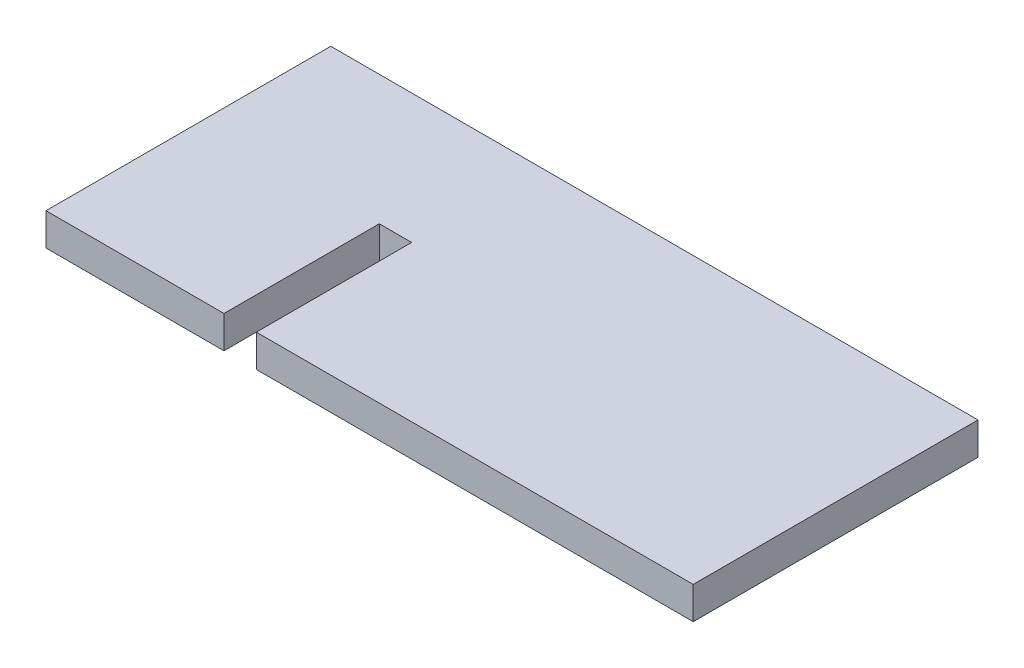
ISO-10303-21;
HEADER;
FILE_DESCRIPTION(('STEP AP214'),'2;1');
FILE_NAME('part.step','',(''),(''),'','','');
FILE_SCHEMA(('AUTOMOTIVE_DESIGN { 1 0 10303 214 1 1 1 1 }'));
ENDSEC;
DATA;
#1=APPLICATION_CONTEXT('core data for automotive mechanical design processes');
#2=APPLICATION_PROTOCOL_DEFINITION('international standard','automotive_design',2000,#1);
#3=PRODUCT_CONTEXT('',#1,'mechanical');
#4=PRODUCT('Part','Part','',(#3));
#5=PRODUCT_RELATED_PRODUCT_CATEGORY('part','',(#4));
#6=PRODUCT_DEFINITION_FORMATION('','',#4);
#7=PRODUCT_DEFINITION_CONTEXT('part definition',#1,'design');
#8=PRODUCT_DEFINITION('design','',#6,#7);
#9=PRODUCT_DEFINITION_SHAPE('','',#8);
#10=(LENGTH_UNIT() NAMED_UNIT(*) SI_UNIT(.MILLI.,.METRE.));
#11=(NAMED_UNIT(*) PLANE_ANGLE_UNIT() SI_UNIT($,.RADIAN.));
#12=(NAMED_UNIT(*) SI_UNIT($,.STERADIAN.) SOLID_ANGLE_UNIT());
#13=UNCERTAINTY_MEASURE_WITH_UNIT(LENGTH_MEASURE(1.E-05),#10,'distance_accuracy_value','');
#14=(GEOMETRIC_REPRESENTATION_CONTEXT(3) GLOBAL_UNCERTAINTY_ASSIGNED_CONTEXT((#13)) GLOBAL_UNIT_ASSIGNED_CONTEXT((#10,
#11,#12)) REPRESENTATION_CONTEXT('',''));
#15=CARTESIAN_POINT('',(0.,0.,0.));
#16=DIRECTION('',(0.,0.,1.));
#17=DIRECTION('',(1.,0.,0.));
#18=AXIS2_PLACEMENT_3D('',#15,#16,#17);
#19=CARTESIAN_POINT('',(0.,3.175,0.));
#20=DIRECTION('',(0.,0.,-1.));
#21=DIRECTION('',(-1.,0.,0.));
#22=AXIS2_PLACEMENT_3D('',#19,#20,#21);
#23=PLANE('',#22);
#24=DIRECTION('',(1.,0.,0.));
#25=VECTOR('',#24,1.);
#26=CARTESIAN_POINT('',(0.,0.,0.));
#27=LINE('',#26,#25);
#28=CARTESIAN_POINT('',(0.,0.,0.));
#29=VERTEX_POINT('',#28);
#30=CARTESIAN_POINT('',(17.4625,0.,0.));
#31=VERTEX_POINT('',#30);
#32=EDGE_CURVE('E171',#29,#31,#27,.T.);
#33=ORIENTED_EDGE('',*,*,#32,.T.);
#34=DIRECTION('',(0.,-1.,0.));
#35=VECTOR('',#34,1.);
#36=CARTESIAN_POINT('',(17.4625,3.175,0.));
#37=LINE('',#36,#35);
#38=CARTESIAN_POINT('',(17.4625,3.175,0.));
#39=VERTEX_POINT('',#38);
#40=EDGE_CURVE('E145',#39,#31,#37,.T.);
#41=ORIENTED_EDGE('',*,*,#40,.F.);
#42=DIRECTION('',(1.,0.,0.));
#43=VECTOR('',#42,1.);
#44=CARTESIAN_POINT('',(0.,3.175,0.));
#45=LINE('',#44,#43);
#46=CARTESIAN_POINT('',(0.,3.175,0.));
#47=VERTEX_POINT('',#46);
#48=EDGE_CURVE('E92',#47,#39,#45,.T.);
#49=ORIENTED_EDGE('',*,*,#48,.F.);
#50=DIRECTION('',(0.,-1.,0.));
#51=VECTOR('',#50,1.);
#52=CARTESIAN_POINT('',(0.,3.175,0.));
#53=LINE('',#52,#51);
#54=EDGE_CURVE('E11',#47,#29,#53,.T.);
#55=ORIENTED_EDGE('',*,*,#54,.T.);
#56=EDGE_LOOP('',(#33,#41,#49,#55));
#57=FACE_BOUND('',#56,.T.);
#58=ADVANCED_FACE('F39',(#57),#23,.F.);
#59=CARTESIAN_POINT('',(0.,3.175,0.));
#60=DIRECTION('',(1.,0.,0.));
#61=DIRECTION('',(0.,0.,-1.));
#62=AXIS2_PLACEMENT_3D('',#59,#60,#61);
#63=PLANE('',#62);
#64=DIRECTION('',(0.,0.,1.));
#65=VECTOR('',#64,1.);
#66=CARTESIAN_POINT('',(0.,0.,0.));
#67=LINE('',#66,#65);
#68=CARTESIAN_POINT('',(0.,0.,-27.94));
#69=VERTEX_POINT('',#68);
#70=EDGE_CURVE('E148',#69,#29,#67,.T.);
#71=ORIENTED_EDGE('',*,*,#70,.T.);
#72=ORIENTED_EDGE('',*,*,#54,.F.);
#73=DIRECTION('',(0.,0.,1.));
#74=VECTOR('',#73,1.);
#75=CARTESIAN_POINT('',(0.,3.175,0.));
#76=LINE('',#75,#74);
#77=CARTESIAN_POINT('',(0.,3.175,-27.94));
#78=VERTEX_POINT('',#77);
#79=EDGE_CURVE('E155',#78,#47,#76,.T.);
#80=ORIENTED_EDGE('',*,*,#79,.F.);
#81=DIRECTION('',(0.,-1.,0.));
#82=VECTOR('',#81,1.);
#83=CARTESIAN_POINT('',(0.,3.175,-27.94));
#84=LINE('',#83,#82);
#85=EDGE_CURVE('E166',#78,#69,#84,.T.);
#86=ORIENTED_EDGE('',*,*,#85,.T.);
#87=EDGE_LOOP('',(#71,#72,#80,#86));
#88=FACE_BOUND('',#87,.T.);
#89=ADVANCED_FACE('F41',(#88),#63,.F.);
#90=CARTESIAN_POINT('',(20.6375,3.175,0.));
#91=VERTEX_POINT('',#90);
#92=CARTESIAN_POINT('',(63.5,3.175,0.));
#93=VERTEX_POINT('',#92);
#94=EDGE_CURVE('E158',#91,#93,#45,.T.);
#95=ORIENTED_EDGE('',*,*,#94,.F.);
#96=DIRECTION('',(0.,-1.,0.));
#97=VECTOR('',#96,1.);
#98=CARTESIAN_POINT('',(20.6375,3.175,0.));
#99=LINE('',#98,#97);
#100=CARTESIAN_POINT('',(20.6375,0.,0.));
#101=VERTEX_POINT('',#100);
#102=EDGE_CURVE('E149',#91,#101,#99,.T.);
#103=ORIENTED_EDGE('',*,*,#102,.T.);
#104=CARTESIAN_POINT('',(63.5,0.,0.));
#105=VERTEX_POINT('',#104);
#106=EDGE_CURVE('E170',#101,#105,#27,.T.);
#107=ORIENTED_EDGE('',*,*,#106,.T.);
#108=DIRECTION('',(0.,-1.,0.));
#109=VECTOR('',#108,1.);
#110=CARTESIAN_POINT('',(63.5,3.175,0.));
#111=LINE('',#110,#109);
#112=EDGE_CURVE('E48',#93,#105,#111,.T.);
#113=ORIENTED_EDGE('',*,*,#112,.F.);
#114=EDGE_LOOP('',(#95,#103,#107,#113));
#115=FACE_BOUND('',#114,.T.);
#116=ADVANCED_FACE('F210',(#115),#23,.F.);
#117=CARTESIAN_POINT('',(63.5,3.175,0.));
#118=DIRECTION('',(-1.,0.,0.));
#119=DIRECTION('',(0.,0.,1.));
#120=AXIS2_PLACEMENT_3D('',#117,#118,#119);
#121=PLANE('',#120);
#122=DIRECTION('',(0.,0.,-1.));
#123=VECTOR('',#122,1.);
#124=CARTESIAN_POINT('',(63.5,0.,0.));
#125=LINE('',#124,#123);
#126=CARTESIAN_POINT('',(63.5,0.,-27.94));
#127=VERTEX_POINT('',#126);
#128=EDGE_CURVE('E175',#105,#127,#125,.T.);
#129=ORIENTED_EDGE('',*,*,#128,.T.);
#130=DIRECTION('',(0.,-1.,0.));
#131=VECTOR('',#130,1.);
#132=CARTESIAN_POINT('',(63.5,3.175,-27.94));
#133=LINE('',#132,#131);
#134=CARTESIAN_POINT('',(63.5,3.175,-27.94));
#135=VERTEX_POINT('',#134);
#136=EDGE_CURVE('E182',#135,#127,#133,.T.);
#137=ORIENTED_EDGE('',*,*,#136,.F.);
#138=DIRECTION('',(0.,0.,-1.));
#139=VECTOR('',#138,1.);
#140=CARTESIAN_POINT('',(63.5,3.175,0.));
#141=LINE('',#140,#139);
#142=EDGE_CURVE('E161',#93,#135,#141,.T.);
#143=ORIENTED_EDGE('',*,*,#142,.F.);
#144=ORIENTED_EDGE('',*,*,#112,.T.);
#145=EDGE_LOOP('',(#129,#137,#143,#144));
#146=FACE_BOUND('',#145,.T.);
#147=ADVANCED_FACE('F190',(#146),#121,.F.);
#148=CARTESIAN_POINT('',(0.,3.175,-27.94));
#149=DIRECTION('',(0.,0.,1.));
#150=DIRECTION('',(1.,0.,0.));
#151=AXIS2_PLACEMENT_3D('',#148,#149,#150);
#152=PLANE('',#151);
#153=DIRECTION('',(-1.,0.,0.));
#154=VECTOR('',#153,1.);
#155=CARTESIAN_POINT('',(0.,0.,-27.94));
#156=LINE('',#155,#154);
#157=EDGE_CURVE('E85',#127,#69,#156,.T.);
#158=ORIENTED_EDGE('',*,*,#157,.T.);
#159=ORIENTED_EDGE('',*,*,#85,.F.);
#160=DIRECTION('',(-1.,0.,0.));
#161=VECTOR('',#160,1.);
#162=CARTESIAN_POINT('',(0.,3.175,-27.94));
#163=LINE('',#162,#161);
#164=EDGE_CURVE('E64',#135,#78,#163,.T.);
#165=ORIENTED_EDGE('',*,*,#164,.F.);
#166=ORIENTED_EDGE('',*,*,#136,.T.);
#167=EDGE_LOOP('',(#158,#159,#165,#166));
#168=FACE_BOUND('',#167,.T.);
#169=ADVANCED_FACE('F202',(#168),#152,.F.);
#170=CARTESIAN_POINT('',(0.,3.175,0.));
#171=DIRECTION('',(0.,-1.,0.));
#172=DIRECTION('',(0.,0.,-1.));
#173=AXIS2_PLACEMENT_3D('',#170,#171,#172);
#174=PLANE('',#173);
#175=ORIENTED_EDGE('',*,*,#48,.T.);
#176=DIRECTION('',(0.,0.,-1.));
#177=VECTOR('',#176,1.);
#178=CARTESIAN_POINT('',(17.4625,3.175,0.));
#179=LINE('',#178,#177);
#180=CARTESIAN_POINT('',(17.4625,3.175,-15.24));
#181=VERTEX_POINT('',#180);
#182=EDGE_CURVE('E116',#39,#181,#179,.T.);
#183=ORIENTED_EDGE('',*,*,#182,.T.);
#184=DIRECTION('',(1.,0.,0.));
#185=VECTOR('',#184,1.);
#186=CARTESIAN_POINT('',(17.4625,3.175,-15.24));
#187=LINE('',#186,#185);
#188=CARTESIAN_POINT('',(20.6375,3.175,-15.24));
#189=VERTEX_POINT('',#188);
#190=EDGE_CURVE('E125',#181,#189,#187,.T.);
#191=ORIENTED_EDGE('',*,*,#190,.T.);
#192=DIRECTION('',(0.,0.,1.));
#193=VECTOR('',#192,1.);
#194=CARTESIAN_POINT('',(20.6375,3.175,0.));
#195=LINE('',#194,#193);
#196=EDGE_CURVE('E122',#189,#91,#195,.T.);
#197=ORIENTED_EDGE('',*,*,#196,.T.);
#198=ORIENTED_EDGE('',*,*,#94,.T.);
#199=ORIENTED_EDGE('',*,*,#142,.T.);
#200=ORIENTED_EDGE('',*,*,#164,.T.);
#201=ORIENTED_EDGE('',*,*,#79,.T.);
#202=EDGE_LOOP('',(#175,#183,#191,#197,#198,#199,#200,#201));
#203=FACE_BOUND('',#202,.T.);
#204=ADVANCED_FACE('F131',(#203),#174,.F.);
#205=CARTESIAN_POINT('',(0.,0.,0.));
#206=DIRECTION('',(0.,-1.,0.));
#207=DIRECTION('',(0.,0.,-1.));
#208=AXIS2_PLACEMENT_3D('',#205,#206,#207);
#209=PLANE('',#208);
#210=DIRECTION('',(0.,0.,-1.));
#211=VECTOR('',#210,1.);
#212=CARTESIAN_POINT('',(17.4625,0.,0.));
#213=LINE('',#212,#211);
#214=CARTESIAN_POINT('',(17.4625,0.,-15.24));
#215=VERTEX_POINT('',#214);
#216=EDGE_CURVE('E55',#31,#215,#213,.T.);
#217=ORIENTED_EDGE('',*,*,#216,.F.);
#218=ORIENTED_EDGE('',*,*,#32,.F.);
#219=ORIENTED_EDGE('',*,*,#70,.F.);
#220=ORIENTED_EDGE('',*,*,#157,.F.);
#221=ORIENTED_EDGE('',*,*,#128,.F.);
#222=ORIENTED_EDGE('',*,*,#106,.F.);
#223=DIRECTION('',(0.,0.,1.));
#224=VECTOR('',#223,1.);
#225=CARTESIAN_POINT('',(20.6375,0.,0.));
#226=LINE('',#225,#224);
#227=CARTESIAN_POINT('',(20.6375,0.,-15.24));
#228=VERTEX_POINT('',#227);
#229=EDGE_CURVE('E133',#228,#101,#226,.T.);
#230=ORIENTED_EDGE('',*,*,#229,.F.);
#231=DIRECTION('',(1.,0.,0.));
#232=VECTOR('',#231,1.);
#233=CARTESIAN_POINT('',(17.4625,0.,-15.24));
#234=LINE('',#233,#232);
#235=EDGE_CURVE('E136',#215,#228,#234,.T.);
#236=ORIENTED_EDGE('',*,*,#235,.F.);
#237=EDGE_LOOP('',(#217,#218,#219,#220,#221,#222,#230,#236));
#238=FACE_BOUND('',#237,.T.);
#239=ADVANCED_FACE('F196',(#238),#209,.T.);
#240=CARTESIAN_POINT('',(17.4625,3.175,0.));
#241=DIRECTION('',(-1.,0.,0.));
#242=DIRECTION('',(0.,0.,1.));
#243=AXIS2_PLACEMENT_3D('',#240,#241,#242);
#244=PLANE('',#243);
#245=ORIENTED_EDGE('',*,*,#216,.T.);
#246=DIRECTION('',(0.,-1.,0.));
#247=VECTOR('',#246,1.);
#248=CARTESIAN_POINT('',(17.4625,3.175,-15.24));
#249=LINE('',#248,#247);
#250=EDGE_CURVE('E112',#181,#215,#249,.T.);
#251=ORIENTED_EDGE('',*,*,#250,.F.);
#252=ORIENTED_EDGE('',*,*,#182,.F.);
#253=ORIENTED_EDGE('',*,*,#40,.T.);
#254=EDGE_LOOP('',(#245,#251,#252,#253));
#255=FACE_BOUND('',#254,.T.);
#256=ADVANCED_FACE('F114',(#255),#244,.F.);
#257=CARTESIAN_POINT('',(20.6375,3.175,0.));
#258=DIRECTION('',(1.,0.,0.));
#259=DIRECTION('',(0.,0.,-1.));
#260=AXIS2_PLACEMENT_3D('',#257,#258,#259);
#261=PLANE('',#260);
#262=ORIENTED_EDGE('',*,*,#229,.T.);
#263=ORIENTED_EDGE('',*,*,#102,.F.);
#264=ORIENTED_EDGE('',*,*,#196,.F.);
#265=DIRECTION('',(0.,-1.,0.));
#266=VECTOR('',#265,1.);
#267=CARTESIAN_POINT('',(20.6375,3.175,-15.24));
#268=LINE('',#267,#266);
#269=EDGE_CURVE('E121',#189,#228,#268,.T.);
#270=ORIENTED_EDGE('',*,*,#269,.T.);
#271=EDGE_LOOP('',(#262,#263,#264,#270));
#272=FACE_BOUND('',#271,.T.);
#273=ADVANCED_FACE('F223',(#272),#261,.F.);
#274=CARTESIAN_POINT('',(17.4625,3.175,-15.24));
#275=DIRECTION('',(0.,0.,-1.));
#276=DIRECTION('',(-1.,0.,0.));
#277=AXIS2_PLACEMENT_3D('',#274,#275,#276);
#278=PLANE('',#277);
#279=ORIENTED_EDGE('',*,*,#235,.T.);
#280=ORIENTED_EDGE('',*,*,#269,.F.);
#281=ORIENTED_EDGE('',*,*,#190,.F.);
#282=ORIENTED_EDGE('',*,*,#250,.T.);
#283=EDGE_LOOP('',(#279,#280,#281,#282));
#284=FACE_BOUND('',#283,.T.);
#285=ADVANCED_FACE('F126',(#284),#278,.F.);
#286=CLOSED_SHELL('',(#58,#89,#116,#147,#169,#204,#239,#256,#273,#285));
#287=MANIFOLD_SOLID_BREP('B2',#286);
#288=ADVANCED_BREP_SHAPE_REPRESENTATION('',(#18,#287),#14);
#289=SHAPE_DEFINITION_REPRESENTATION(#9,#288);
ENDSEC;
END-ISO-10303-21;
